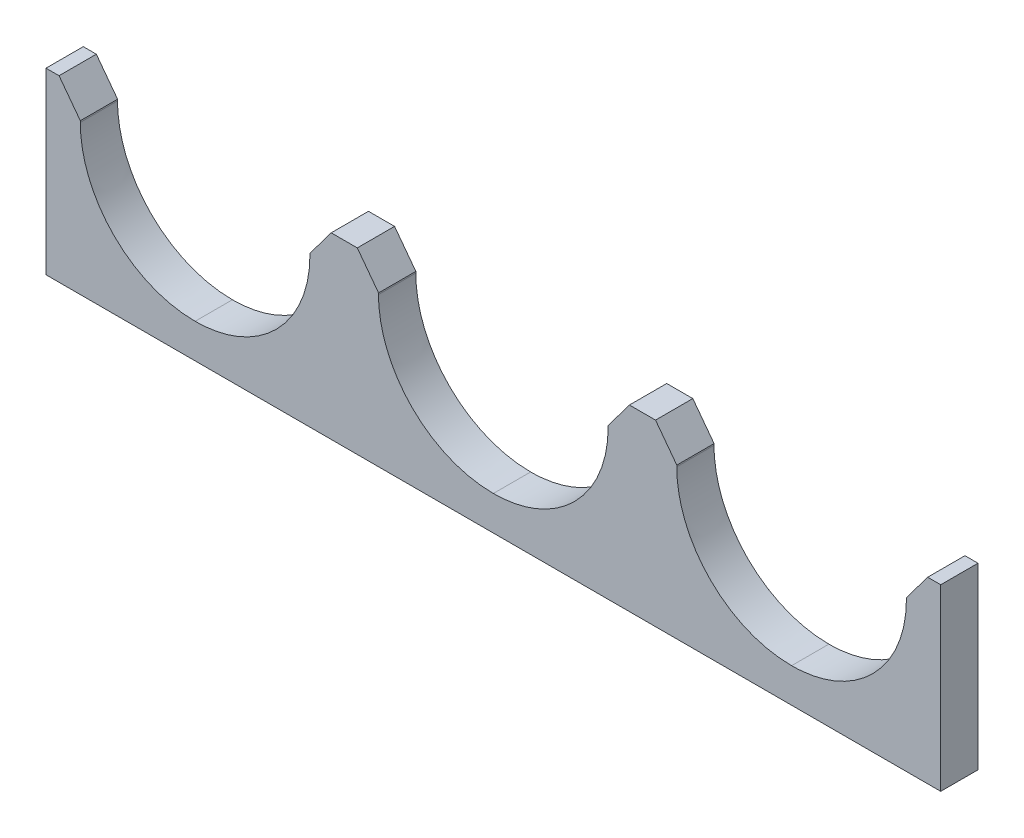
ISO-10303-21;
HEADER;
FILE_DESCRIPTION(('STEP AP214'),'2;1');
FILE_NAME('part.step','',(''),(''),'','','');
FILE_SCHEMA(('AUTOMOTIVE_DESIGN { 1 0 10303 214 1 1 1 1 }'));
ENDSEC;
DATA;
#1=APPLICATION_CONTEXT('core data for automotive mechanical design processes');
#2=APPLICATION_PROTOCOL_DEFINITION('international standard','automotive_design',2000,#1);
#3=PRODUCT_CONTEXT('',#1,'mechanical');
#4=PRODUCT('Part','Part','',(#3));
#5=PRODUCT_RELATED_PRODUCT_CATEGORY('part','',(#4));
#6=PRODUCT_DEFINITION_FORMATION('','',#4);
#7=PRODUCT_DEFINITION_CONTEXT('part definition',#1,'design');
#8=PRODUCT_DEFINITION('design','',#6,#7);
#9=PRODUCT_DEFINITION_SHAPE('','',#8);
#10=(LENGTH_UNIT() NAMED_UNIT(*) SI_UNIT(.MILLI.,.METRE.));
#11=(NAMED_UNIT(*) PLANE_ANGLE_UNIT() SI_UNIT($,.RADIAN.));
#12=(NAMED_UNIT(*) SI_UNIT($,.STERADIAN.) SOLID_ANGLE_UNIT());
#13=UNCERTAINTY_MEASURE_WITH_UNIT(LENGTH_MEASURE(1.E-05),#10,'distance_accuracy_value','');
#14=(GEOMETRIC_REPRESENTATION_CONTEXT(3) GLOBAL_UNCERTAINTY_ASSIGNED_CONTEXT((#13)) GLOBAL_UNIT_ASSIGNED_CONTEXT((#10,
#11,#12)) REPRESENTATION_CONTEXT('',''));
#15=CARTESIAN_POINT('',(0.,0.,0.));
#16=DIRECTION('',(0.,0.,1.));
#17=DIRECTION('',(1.,0.,0.));
#18=AXIS2_PLACEMENT_3D('',#15,#16,#17);
#19=CARTESIAN_POINT('',(322.974945746528,-237.241366314888,12.5));
#20=CARTESIAN_POINT('',(322.977012803819,-237.405180605253,12.5));
#21=CARTESIAN_POINT('',(322.981189982096,-237.568499663141,12.5));
#22=CARTESIAN_POINT('',(322.981189982096,-237.732809185982,12.5));
#23=B_SPLINE_CURVE_WITH_KNOTS('',3,(#19,#20,#21,#22),.UNSPECIFIED.,.F.,.F.,(4,4),(0.,1.),.UNSPECIFIED.);
#24=DIRECTION('',(0.,0.,-1.));
#25=VECTOR('',#24,1.);
#26=SURFACE_OF_LINEAR_EXTRUSION('',#23,#25);
#27=CARTESIAN_POINT('',(322.974945746528,-237.241366314888,0.));
#28=CARTESIAN_POINT('',(322.977012803819,-237.405180605253,0.));
#29=CARTESIAN_POINT('',(322.981189982096,-237.568499663141,0.));
#30=CARTESIAN_POINT('',(322.981189982096,-237.732809185982,0.));
#31=B_SPLINE_CURVE_WITH_KNOTS('',3,(#27,#28,#29,#30),.UNSPECIFIED.,.F.,.F.,(4,4),(0.,1.),.UNSPECIFIED.);
#32=CARTESIAN_POINT('',(322.974945746528,-237.241366314888,0.));
#33=VERTEX_POINT('',#32);
#34=CARTESIAN_POINT('',(322.981189982096,-237.732809185982,0.));
#35=VERTEX_POINT('',#34);
#36=EDGE_CURVE('E231',#33,#35,#31,.T.);
#37=ORIENTED_EDGE('',*,*,#36,.T.);
#38=DIRECTION('',(0.,0.,-1.));
#39=VECTOR('',#38,1.);
#40=CARTESIAN_POINT('',(322.981189982096,-237.732809185982,12.5));
#41=LINE('',#40,#39);
#42=CARTESIAN_POINT('',(322.981189982096,-237.732809185982,12.5));
#43=VERTEX_POINT('',#42);
#44=EDGE_CURVE('E11',#43,#35,#41,.T.);
#45=ORIENTED_EDGE('',*,*,#44,.F.);
#46=CARTESIAN_POINT('',(322.974945746528,-237.241366314888,12.5));
#47=VERTEX_POINT('',#46);
#48=EDGE_CURVE('E339',#47,#43,#23,.T.);
#49=ORIENTED_EDGE('',*,*,#48,.F.);
#50=DIRECTION('',(0.,0.,-1.));
#51=VECTOR('',#50,1.);
#52=CARTESIAN_POINT('',(322.974945746528,-237.241366314888,12.5));
#53=LINE('',#52,#51);
#54=EDGE_CURVE('E227',#47,#33,#53,.T.);
#55=ORIENTED_EDGE('',*,*,#54,.T.);
#56=EDGE_LOOP('',(#37,#45,#49,#55));
#57=FACE_BOUND('',#56,.T.);
#58=ADVANCED_FACE('F32',(#57),#26,.F.);
#59=CARTESIAN_POINT('',(322.981189982096,-237.732809185982,12.5));
#60=CARTESIAN_POINT('',(322.981189982096,-258.995766271485,12.5));
#61=CARTESIAN_POINT('',(305.744128417969,-276.232806303766,12.5));
#62=CARTESIAN_POINT('',(284.481171332465,-276.232806303766,12.5));
#63=B_SPLINE_CURVE_WITH_KNOTS('',3,(#59,#60,#61,#62),.UNSPECIFIED.,.F.,.F.,(4,4),(1.,2.),.UNSPECIFIED.);
#64=DIRECTION('',(0.,0.,-1.));
#65=VECTOR('',#64,1.);
#66=SURFACE_OF_LINEAR_EXTRUSION('',#63,#65);
#67=CARTESIAN_POINT('',(322.981189982096,-237.732809185982,0.));
#68=CARTESIAN_POINT('',(322.981189982096,-258.995766271485,0.));
#69=CARTESIAN_POINT('',(305.744128417969,-276.232806303766,0.));
#70=CARTESIAN_POINT('',(284.481171332465,-276.232806303766,0.));
#71=B_SPLINE_CURVE_WITH_KNOTS('',3,(#67,#68,#69,#70),.UNSPECIFIED.,.F.,.F.,(4,4),(1.,2.),.UNSPECIFIED.);
#72=CARTESIAN_POINT('',(284.481171332465,-276.232806303766,0.));
#73=VERTEX_POINT('',#72);
#74=EDGE_CURVE('E236',#35,#73,#71,.T.);
#75=ORIENTED_EDGE('',*,*,#74,.T.);
#76=DIRECTION('',(0.,0.,-1.));
#77=VECTOR('',#76,1.);
#78=CARTESIAN_POINT('',(284.481171332465,-276.232806303766,12.5));
#79=LINE('',#78,#77);
#80=CARTESIAN_POINT('',(284.481171332465,-276.232806303766,12.5));
#81=VERTEX_POINT('',#80);
#82=EDGE_CURVE('E41',#81,#73,#79,.T.);
#83=ORIENTED_EDGE('',*,*,#82,.F.);
#84=EDGE_CURVE('E143',#43,#81,#63,.T.);
#85=ORIENTED_EDGE('',*,*,#84,.F.);
#86=ORIENTED_EDGE('',*,*,#44,.T.);
#87=EDGE_LOOP('',(#75,#83,#85,#86));
#88=FACE_BOUND('',#87,.T.);
#89=ADVANCED_FACE('F468',(#88),#66,.F.);
#90=CARTESIAN_POINT('',(284.481171332465,-276.232806303766,12.5));
#91=CARTESIAN_POINT('',(263.218214246962,-276.232806303766,12.5));
#92=CARTESIAN_POINT('',(245.981174214681,-258.995766271485,12.5));
#93=CARTESIAN_POINT('',(245.981174214681,-237.732809185982,12.5));
#94=B_SPLINE_CURVE_WITH_KNOTS('',3,(#90,#91,#92,#93),.UNSPECIFIED.,.F.,.F.,(4,4),(2.,3.),.UNSPECIFIED.);
#95=DIRECTION('',(0.,0.,-1.));
#96=VECTOR('',#95,1.);
#97=SURFACE_OF_LINEAR_EXTRUSION('',#94,#96);
#98=CARTESIAN_POINT('',(284.481171332465,-276.232806303766,0.));
#99=CARTESIAN_POINT('',(263.218214246962,-276.232806303766,0.));
#100=CARTESIAN_POINT('',(245.981174214681,-258.995766271485,0.));
#101=CARTESIAN_POINT('',(245.981174214681,-237.732809185982,0.));
#102=B_SPLINE_CURVE_WITH_KNOTS('',3,(#98,#99,#100,#101),.UNSPECIFIED.,.F.,.F.,(4,4),(2.,3.),.UNSPECIFIED.);
#103=CARTESIAN_POINT('',(245.981174214681,-237.732809185982,0.));
#104=VERTEX_POINT('',#103);
#105=EDGE_CURVE('E243',#73,#104,#102,.T.);
#106=ORIENTED_EDGE('',*,*,#105,.T.);
#107=DIRECTION('',(0.,0.,-1.));
#108=VECTOR('',#107,1.);
#109=CARTESIAN_POINT('',(245.981174214681,-237.732809185982,12.5));
#110=LINE('',#109,#108);
#111=CARTESIAN_POINT('',(245.981174214681,-237.732809185982,12.5));
#112=VERTEX_POINT('',#111);
#113=EDGE_CURVE('E397',#112,#104,#110,.T.);
#114=ORIENTED_EDGE('',*,*,#113,.F.);
#115=EDGE_CURVE('E405',#81,#112,#94,.T.);
#116=ORIENTED_EDGE('',*,*,#115,.F.);
#117=ORIENTED_EDGE('',*,*,#82,.T.);
#118=EDGE_LOOP('',(#106,#114,#116,#117));
#119=FACE_BOUND('',#118,.T.);
#120=ADVANCED_FACE('F403',(#119),#97,.F.);
#121=CARTESIAN_POINT('',(245.981174214681,-237.732809185982,12.5));
#122=CARTESIAN_POINT('',(245.981174214681,-237.568478131294,12.5));
#123=CARTESIAN_POINT('',(245.985351392958,-237.405180605253,12.5));
#124=CARTESIAN_POINT('',(245.987396918403,-237.241344783041,12.5));
#125=B_SPLINE_CURVE_WITH_KNOTS('',3,(#121,#122,#123,#124),.UNSPECIFIED.,.F.,.F.,(4,4),(3.,4.),.UNSPECIFIED.);
#126=DIRECTION('',(0.,0.,-1.));
#127=VECTOR('',#126,1.);
#128=SURFACE_OF_LINEAR_EXTRUSION('',#125,#127);
#129=CARTESIAN_POINT('',(245.981174214681,-237.732809185982,0.));
#130=CARTESIAN_POINT('',(245.981174214681,-237.568478131294,0.));
#131=CARTESIAN_POINT('',(245.985351392958,-237.405180605253,0.));
#132=CARTESIAN_POINT('',(245.987396918403,-237.241344783041,0.));
#133=B_SPLINE_CURVE_WITH_KNOTS('',3,(#129,#130,#131,#132),.UNSPECIFIED.,.F.,.F.,(4,4),(3.,4.),.UNSPECIFIED.);
#134=CARTESIAN_POINT('',(245.987396918403,-237.241344783041,0.));
#135=VERTEX_POINT('',#134);
#136=EDGE_CURVE('E250',#104,#135,#133,.T.);
#137=ORIENTED_EDGE('',*,*,#136,.T.);
#138=DIRECTION('',(0.,0.,-1.));
#139=VECTOR('',#138,1.);
#140=CARTESIAN_POINT('',(245.987396918403,-237.241344783041,12.5));
#141=LINE('',#140,#139);
#142=CARTESIAN_POINT('',(245.987396918403,-237.241344783041,12.5));
#143=VERTEX_POINT('',#142);
#144=EDGE_CURVE('E394',#143,#135,#141,.T.);
#145=ORIENTED_EDGE('',*,*,#144,.F.);
#146=EDGE_CURVE('E423',#112,#143,#125,.T.);
#147=ORIENTED_EDGE('',*,*,#146,.F.);
#148=ORIENTED_EDGE('',*,*,#113,.T.);
#149=EDGE_LOOP('',(#137,#145,#147,#148));
#150=FACE_BOUND('',#149,.T.);
#151=ADVANCED_FACE('F414',(#150),#128,.F.);
#152=CARTESIAN_POINT('',(245.987396918403,-237.241344783041,12.5));
#153=DIRECTION('',(-0.800074782706946,-0.599900276776427,0.));
#154=DIRECTION('',(0.599900276776427,-0.800074782706946,0.));
#155=AXIS2_PLACEMENT_3D('',#152,#153,#154);
#156=PLANE('',#155);
#157=DIRECTION('',(-0.599900276776427,0.800074782706946,0.));
#158=VECTOR('',#157,1.);
#159=CARTESIAN_POINT('',(245.987396918403,-237.241344783041,0.));
#160=LINE('',#159,#158);
#161=CARTESIAN_POINT('',(238.857836405436,-227.732795113987,0.));
#162=VERTEX_POINT('',#161);
#163=EDGE_CURVE('E257',#135,#162,#160,.T.);
#164=ORIENTED_EDGE('',*,*,#163,.T.);
#165=DIRECTION('',(0.,0.,-1.));
#166=VECTOR('',#165,1.);
#167=CARTESIAN_POINT('',(238.857836405436,-227.732795113987,12.5));
#168=LINE('',#167,#166);
#169=CARTESIAN_POINT('',(238.857836405436,-227.732795113987,12.5));
#170=VERTEX_POINT('',#169);
#171=EDGE_CURVE('E391',#170,#162,#168,.T.);
#172=ORIENTED_EDGE('',*,*,#171,.F.);
#173=DIRECTION('',(-0.599900276776427,0.800074782706946,0.));
#174=VECTOR('',#173,1.);
#175=CARTESIAN_POINT('',(245.987396918403,-237.241344783041,12.5));
#176=LINE('',#175,#174);
#177=EDGE_CURVE('E420',#143,#170,#176,.T.);
#178=ORIENTED_EDGE('',*,*,#177,.F.);
#179=ORIENTED_EDGE('',*,*,#144,.T.);
#180=EDGE_LOOP('',(#164,#172,#178,#179));
#181=FACE_BOUND('',#180,.T.);
#182=ADVANCED_FACE('F418',(#181),#156,.F.);
#183=CARTESIAN_POINT('',(238.857836405436,-227.732795113987,12.5));
#184=DIRECTION('',(0.,-1.,0.));
#185=DIRECTION('',(0.,0.,-1.));
#186=AXIS2_PLACEMENT_3D('',#183,#184,#185);
#187=PLANE('',#186);
#188=DIRECTION('',(-1.,0.,0.));
#189=VECTOR('',#188,1.);
#190=CARTESIAN_POINT('',(238.857836405436,-227.732795113987,0.));
#191=LINE('',#190,#189);
#192=CARTESIAN_POINT('',(230.104537794325,-227.732795113987,0.));
#193=VERTEX_POINT('',#192);
#194=EDGE_CURVE('E262',#162,#193,#191,.T.);
#195=ORIENTED_EDGE('',*,*,#194,.T.);
#196=DIRECTION('',(0.,0.,-1.));
#197=VECTOR('',#196,1.);
#198=CARTESIAN_POINT('',(230.104537794325,-227.732795113987,12.5));
#199=LINE('',#198,#197);
#200=CARTESIAN_POINT('',(230.104537794325,-227.732795113987,12.5));
#201=VERTEX_POINT('',#200);
#202=EDGE_CURVE('E388',#201,#193,#199,.T.);
#203=ORIENTED_EDGE('',*,*,#202,.F.);
#204=DIRECTION('',(-1.,0.,0.));
#205=VECTOR('',#204,1.);
#206=CARTESIAN_POINT('',(238.857836405436,-227.732795113987,12.5));
#207=LINE('',#206,#205);
#208=EDGE_CURVE('E422',#170,#201,#207,.T.);
#209=ORIENTED_EDGE('',*,*,#208,.F.);
#210=ORIENTED_EDGE('',*,*,#171,.T.);
#211=EDGE_LOOP('',(#195,#203,#209,#210));
#212=FACE_BOUND('',#211,.T.);
#213=ADVANCED_FACE('F458',(#212),#187,.F.);
#214=CARTESIAN_POINT('',(230.104537794325,-227.732795113987,12.5));
#215=DIRECTION('',(0.80007456514426,-0.59990056693524,0.));
#216=DIRECTION('',(0.59990056693524,0.800074565144261,0.));
#217=AXIS2_PLACEMENT_3D('',#214,#215,#216);
#218=PLANE('',#217);
#219=DIRECTION('',(-0.59990056693524,-0.80007456514426,0.));
#220=VECTOR('',#219,1.);
#221=CARTESIAN_POINT('',(230.104537794325,-227.732795113987,0.));
#222=LINE('',#221,#220);
#223=CARTESIAN_POINT('',(222.974955749512,-237.241366314888,0.));
#224=VERTEX_POINT('',#223);
#225=EDGE_CURVE('E264',#193,#224,#222,.T.);
#226=ORIENTED_EDGE('',*,*,#225,.T.);
#227=DIRECTION('',(0.,0.,-1.));
#228=VECTOR('',#227,1.);
#229=CARTESIAN_POINT('',(222.974955749512,-237.241366314888,12.5));
#230=LINE('',#229,#228);
#231=CARTESIAN_POINT('',(222.974955749512,-237.241366314888,12.5));
#232=VERTEX_POINT('',#231);
#233=EDGE_CURVE('E385',#232,#224,#230,.T.);
#234=ORIENTED_EDGE('',*,*,#233,.F.);
#235=DIRECTION('',(-0.59990056693524,-0.80007456514426,0.));
#236=VECTOR('',#235,1.);
#237=CARTESIAN_POINT('',(230.104537794325,-227.732795113987,12.5));
#238=LINE('',#237,#236);
#239=EDGE_CURVE('E425',#201,#232,#238,.T.);
#240=ORIENTED_EDGE('',*,*,#239,.F.);
#241=ORIENTED_EDGE('',*,*,#202,.T.);
#242=EDGE_LOOP('',(#226,#234,#240,#241));
#243=FACE_BOUND('',#242,.T.);
#244=ADVANCED_FACE('F453',(#243),#218,.F.);
#245=CARTESIAN_POINT('',(222.974955749512,-237.241366314888,12.5));
#246=CARTESIAN_POINT('',(222.977001274957,-237.405180605253,12.5));
#247=CARTESIAN_POINT('',(222.981178453233,-237.568499663141,12.5));
#248=CARTESIAN_POINT('',(222.981178453233,-237.732809185982,12.5));
#249=B_SPLINE_CURVE_WITH_KNOTS('',3,(#245,#246,#247,#248),.UNSPECIFIED.,.F.,.F.,(4,4),(7.,8.),.UNSPECIFIED.);
#250=DIRECTION('',(0.,0.,-1.));
#251=VECTOR('',#250,1.);
#252=SURFACE_OF_LINEAR_EXTRUSION('',#249,#251);
#253=CARTESIAN_POINT('',(222.974955749512,-237.241366314888,0.));
#254=CARTESIAN_POINT('',(222.977001274957,-237.405180605253,0.));
#255=CARTESIAN_POINT('',(222.981178453233,-237.568499663141,0.));
#256=CARTESIAN_POINT('',(222.981178453233,-237.732809185982,0.));
#257=B_SPLINE_CURVE_WITH_KNOTS('',3,(#253,#254,#255,#256),.UNSPECIFIED.,.F.,.F.,(4,4),(7.,8.),.UNSPECIFIED.);
#258=CARTESIAN_POINT('',(222.981178453233,-237.732809185982,0.));
#259=VERTEX_POINT('',#258);
#260=EDGE_CURVE('E266',#224,#259,#257,.T.);
#261=ORIENTED_EDGE('',*,*,#260,.T.);
#262=DIRECTION('',(0.,0.,-1.));
#263=VECTOR('',#262,1.);
#264=CARTESIAN_POINT('',(222.981178453233,-237.732809185982,12.5));
#265=LINE('',#264,#263);
#266=CARTESIAN_POINT('',(222.981178453233,-237.732809185982,12.5));
#267=VERTEX_POINT('',#266);
#268=EDGE_CURVE('E382',#267,#259,#265,.T.);
#269=ORIENTED_EDGE('',*,*,#268,.F.);
#270=EDGE_CURVE('E434',#232,#267,#249,.T.);
#271=ORIENTED_EDGE('',*,*,#270,.F.);
#272=ORIENTED_EDGE('',*,*,#233,.T.);
#273=EDGE_LOOP('',(#261,#269,#271,#272));
#274=FACE_BOUND('',#273,.T.);
#275=ADVANCED_FACE('F448',(#274),#252,.F.);
#276=CARTESIAN_POINT('',(222.981178453233,-237.732809185982,12.5));
#277=CARTESIAN_POINT('',(222.981178453233,-258.995766271485,12.5));
#278=CARTESIAN_POINT('',(205.744138420953,-276.232806303766,12.5));
#279=CARTESIAN_POINT('',(184.481181335449,-276.232806303766,12.5));
#280=B_SPLINE_CURVE_WITH_KNOTS('',3,(#276,#277,#278,#279),.UNSPECIFIED.,.F.,.F.,(4,4),(8.,9.),.UNSPECIFIED.);
#281=DIRECTION('',(0.,0.,-1.));
#282=VECTOR('',#281,1.);
#283=SURFACE_OF_LINEAR_EXTRUSION('',#280,#282);
#284=CARTESIAN_POINT('',(222.981178453233,-237.732809185982,0.));
#285=CARTESIAN_POINT('',(222.981178453233,-258.995766271485,0.));
#286=CARTESIAN_POINT('',(205.744138420953,-276.232806303766,0.));
#287=CARTESIAN_POINT('',(184.481181335449,-276.232806303766,0.));
#288=B_SPLINE_CURVE_WITH_KNOTS('',3,(#284,#285,#286,#287),.UNSPECIFIED.,.F.,.F.,(4,4),(8.,9.),.UNSPECIFIED.);
#289=CARTESIAN_POINT('',(184.481181335449,-276.232806303766,0.));
#290=VERTEX_POINT('',#289);
#291=EDGE_CURVE('E270',#259,#290,#288,.T.);
#292=ORIENTED_EDGE('',*,*,#291,.T.);
#293=DIRECTION('',(0.,0.,-1.));
#294=VECTOR('',#293,1.);
#295=CARTESIAN_POINT('',(184.481181335449,-276.232806303766,12.5));
#296=LINE('',#295,#294);
#297=CARTESIAN_POINT('',(184.481181335449,-276.232806303766,12.5));
#298=VERTEX_POINT('',#297);
#299=EDGE_CURVE('E379',#298,#290,#296,.T.);
#300=ORIENTED_EDGE('',*,*,#299,.F.);
#301=EDGE_CURVE('E439',#267,#298,#280,.T.);
#302=ORIENTED_EDGE('',*,*,#301,.F.);
#303=ORIENTED_EDGE('',*,*,#268,.T.);
#304=EDGE_LOOP('',(#292,#300,#302,#303));
#305=FACE_BOUND('',#304,.T.);
#306=ADVANCED_FACE('F452',(#305),#283,.F.);
#307=CARTESIAN_POINT('',(184.481181335449,-276.232806303766,12.5));
#308=CARTESIAN_POINT('',(163.218224249946,-276.232806303766,12.5));
#309=CARTESIAN_POINT('',(145.981184217665,-258.995766271485,12.5));
#310=CARTESIAN_POINT('',(145.981184217665,-237.732809185982,12.5));
#311=B_SPLINE_CURVE_WITH_KNOTS('',3,(#307,#308,#309,#310),.UNSPECIFIED.,.F.,.F.,(4,4),(9.,10.),.UNSPECIFIED.);
#312=DIRECTION('',(0.,0.,-1.));
#313=VECTOR('',#312,1.);
#314=SURFACE_OF_LINEAR_EXTRUSION('',#311,#313);
#315=CARTESIAN_POINT('',(184.481181335449,-276.232806303766,0.));
#316=CARTESIAN_POINT('',(163.218224249946,-276.232806303766,0.));
#317=CARTESIAN_POINT('',(145.981184217665,-258.995766271485,0.));
#318=CARTESIAN_POINT('',(145.981184217665,-237.732809185982,0.));
#319=B_SPLINE_CURVE_WITH_KNOTS('',3,(#315,#316,#317,#318),.UNSPECIFIED.,.F.,.F.,(4,4),(9.,10.),.UNSPECIFIED.);
#320=CARTESIAN_POINT('',(145.981184217665,-237.732809185982,0.));
#321=VERTEX_POINT('',#320);
#322=EDGE_CURVE('E277',#290,#321,#319,.T.);
#323=ORIENTED_EDGE('',*,*,#322,.T.);
#324=DIRECTION('',(0.,0.,-1.));
#325=VECTOR('',#324,1.);
#326=CARTESIAN_POINT('',(145.981184217665,-237.732809185982,12.5));
#327=LINE('',#326,#325);
#328=CARTESIAN_POINT('',(145.981184217665,-237.732809185982,12.5));
#329=VERTEX_POINT('',#328);
#330=EDGE_CURVE('E376',#329,#321,#327,.T.);
#331=ORIENTED_EDGE('',*,*,#330,.F.);
#332=EDGE_CURVE('E783',#298,#329,#311,.T.);
#333=ORIENTED_EDGE('',*,*,#332,.F.);
#334=ORIENTED_EDGE('',*,*,#299,.T.);
#335=EDGE_LOOP('',(#323,#331,#333,#334));
#336=FACE_BOUND('',#335,.T.);
#337=ADVANCED_FACE('F546',(#336),#314,.F.);
#338=CARTESIAN_POINT('',(145.981184217665,-237.732809185982,12.5));
#339=CARTESIAN_POINT('',(145.981184217665,-237.568499663141,12.5));
#340=CARTESIAN_POINT('',(145.985361395942,-237.405180605253,12.5));
#341=CARTESIAN_POINT('',(145.987406921387,-237.241344783041,12.5));
#342=B_SPLINE_CURVE_WITH_KNOTS('',3,(#338,#339,#340,#341),.UNSPECIFIED.,.F.,.F.,(4,4),(10.,11.),.UNSPECIFIED.);
#343=DIRECTION('',(0.,0.,-1.));
#344=VECTOR('',#343,1.);
#345=SURFACE_OF_LINEAR_EXTRUSION('',#342,#344);
#346=CARTESIAN_POINT('',(145.981184217665,-237.732809185982,0.));
#347=CARTESIAN_POINT('',(145.981184217665,-237.568499663141,0.));
#348=CARTESIAN_POINT('',(145.985361395942,-237.405180605253,0.));
#349=CARTESIAN_POINT('',(145.987406921387,-237.241344783041,0.));
#350=B_SPLINE_CURVE_WITH_KNOTS('',3,(#346,#347,#348,#349),.UNSPECIFIED.,.F.,.F.,(4,4),(10.,11.),.UNSPECIFIED.);
#351=CARTESIAN_POINT('',(145.987406921387,-237.241344783041,0.));
#352=VERTEX_POINT('',#351);
#353=EDGE_CURVE('E284',#321,#352,#350,.T.);
#354=ORIENTED_EDGE('',*,*,#353,.T.);
#355=DIRECTION('',(0.,0.,-1.));
#356=VECTOR('',#355,1.);
#357=CARTESIAN_POINT('',(145.987406921387,-237.241344783041,12.5));
#358=LINE('',#357,#356);
#359=CARTESIAN_POINT('',(145.987406921387,-237.241344783041,12.5));
#360=VERTEX_POINT('',#359);
#361=EDGE_CURVE('E373',#360,#352,#358,.T.);
#362=ORIENTED_EDGE('',*,*,#361,.F.);
#363=EDGE_CURVE('E781',#329,#360,#342,.T.);
#364=ORIENTED_EDGE('',*,*,#363,.F.);
#365=ORIENTED_EDGE('',*,*,#330,.T.);
#366=EDGE_LOOP('',(#354,#362,#364,#365));
#367=FACE_BOUND('',#366,.T.);
#368=ADVANCED_FACE('F555',(#367),#345,.F.);
#369=CARTESIAN_POINT('',(145.987406921387,-237.241344783041,12.5));
#370=DIRECTION('',(-0.800074782706946,-0.599900276776427,0.));
#371=DIRECTION('',(0.599900276776427,-0.800074782706946,0.));
#372=AXIS2_PLACEMENT_3D('',#369,#370,#371);
#373=PLANE('',#372);
#374=DIRECTION('',(-0.599900276776427,0.800074782706946,0.));
#375=VECTOR('',#374,1.);
#376=CARTESIAN_POINT('',(145.987406921387,-237.241344783041,0.));
#377=LINE('',#376,#375);
#378=CARTESIAN_POINT('',(138.85784640842,-227.732795113987,0.));
#379=VERTEX_POINT('',#378);
#380=EDGE_CURVE('E291',#352,#379,#377,.T.);
#381=ORIENTED_EDGE('',*,*,#380,.T.);
#382=DIRECTION('',(0.,0.,-1.));
#383=VECTOR('',#382,1.);
#384=CARTESIAN_POINT('',(138.85784640842,-227.732795113987,12.5));
#385=LINE('',#384,#383);
#386=CARTESIAN_POINT('',(138.85784640842,-227.732795113987,12.5));
#387=VERTEX_POINT('',#386);
#388=EDGE_CURVE('E370',#387,#379,#385,.T.);
#389=ORIENTED_EDGE('',*,*,#388,.F.);
#390=DIRECTION('',(-0.599900276776427,0.800074782706946,0.));
#391=VECTOR('',#390,1.);
#392=CARTESIAN_POINT('',(145.987406921387,-237.241344783041,12.5));
#393=LINE('',#392,#391);
#394=EDGE_CURVE('E774',#360,#387,#393,.T.);
#395=ORIENTED_EDGE('',*,*,#394,.F.);
#396=ORIENTED_EDGE('',*,*,#361,.T.);
#397=EDGE_LOOP('',(#381,#389,#395,#396));
#398=FACE_BOUND('',#397,.T.);
#399=ADVANCED_FACE('F564',(#398),#373,.F.);
#400=CARTESIAN_POINT('',(138.85784640842,-227.732795113987,12.5));
#401=DIRECTION('',(0.,-1.,0.));
#402=DIRECTION('',(0.,0.,-1.));
#403=AXIS2_PLACEMENT_3D('',#400,#401,#402);
#404=PLANE('',#403);
#405=DIRECTION('',(-1.,0.,0.));
#406=VECTOR('',#405,1.);
#407=CARTESIAN_POINT('',(138.85784640842,-227.732795113987,0.));
#408=LINE('',#407,#406);
#409=CARTESIAN_POINT('',(130.104547797309,-227.732795113987,0.));
#410=VERTEX_POINT('',#409);
#411=EDGE_CURVE('E296',#379,#410,#408,.T.);
#412=ORIENTED_EDGE('',*,*,#411,.T.);
#413=DIRECTION('',(0.,0.,-1.));
#414=VECTOR('',#413,1.);
#415=CARTESIAN_POINT('',(130.104547797309,-227.732795113987,12.5));
#416=LINE('',#415,#414);
#417=CARTESIAN_POINT('',(130.104547797309,-227.732795113987,12.5));
#418=VERTEX_POINT('',#417);
#419=EDGE_CURVE('E367',#418,#410,#416,.T.);
#420=ORIENTED_EDGE('',*,*,#419,.F.);
#421=DIRECTION('',(-1.,0.,0.));
#422=VECTOR('',#421,1.);
#423=CARTESIAN_POINT('',(138.85784640842,-227.732795113987,12.5));
#424=LINE('',#423,#422);
#425=EDGE_CURVE('E771',#387,#418,#424,.T.);
#426=ORIENTED_EDGE('',*,*,#425,.F.);
#427=ORIENTED_EDGE('',*,*,#388,.T.);
#428=EDGE_LOOP('',(#412,#420,#426,#427));
#429=FACE_BOUND('',#428,.T.);
#430=ADVANCED_FACE('F574',(#429),#404,.F.);
#431=CARTESIAN_POINT('',(130.104547797309,-227.732795113987,12.5));
#432=DIRECTION('',(0.800074565144272,-0.599900566935224,0.));
#433=DIRECTION('',(0.599900566935224,0.800074565144272,0.));
#434=AXIS2_PLACEMENT_3D('',#431,#432,#433);
#435=PLANE('',#434);
#436=DIRECTION('',(-0.599900566935224,-0.800074565144272,0.));
#437=VECTOR('',#436,1.);
#438=CARTESIAN_POINT('',(130.104547797309,-227.732795113987,0.));
#439=LINE('',#438,#437);
#440=CARTESIAN_POINT('',(122.974965752496,-237.241366314888,0.));
#441=VERTEX_POINT('',#440);
#442=EDGE_CURVE('E298',#410,#441,#439,.T.);
#443=ORIENTED_EDGE('',*,*,#442,.T.);
#444=DIRECTION('',(0.,0.,-1.));
#445=VECTOR('',#444,1.);
#446=CARTESIAN_POINT('',(122.974965752496,-237.241366314888,12.5));
#447=LINE('',#446,#445);
#448=CARTESIAN_POINT('',(122.974965752496,-237.241366314888,12.5));
#449=VERTEX_POINT('',#448);
#450=EDGE_CURVE('E364',#449,#441,#447,.T.);
#451=ORIENTED_EDGE('',*,*,#450,.F.);
#452=DIRECTION('',(-0.599900566935224,-0.800074565144272,0.));
#453=VECTOR('',#452,1.);
#454=CARTESIAN_POINT('',(130.104547797309,-227.732795113987,12.5));
#455=LINE('',#454,#453);
#456=EDGE_CURVE('E769',#418,#449,#455,.T.);
#457=ORIENTED_EDGE('',*,*,#456,.F.);
#458=ORIENTED_EDGE('',*,*,#419,.T.);
#459=EDGE_LOOP('',(#443,#451,#457,#458));
#460=FACE_BOUND('',#459,.T.);
#461=ADVANCED_FACE('F584',(#460),#435,.F.);
#462=CARTESIAN_POINT('',(122.974965752496,-237.241366314888,12.5));
#463=CARTESIAN_POINT('',(122.977011277941,-237.405180605253,12.5));
#464=CARTESIAN_POINT('',(122.981188456217,-237.568499663141,12.5));
#465=CARTESIAN_POINT('',(122.981188456217,-237.732809185982,12.5));
#466=B_SPLINE_CURVE_WITH_KNOTS('',3,(#462,#463,#464,#465),.UNSPECIFIED.,.F.,.F.,(4,4),(14.,15.),.UNSPECIFIED.);
#467=DIRECTION('',(0.,0.,-1.));
#468=VECTOR('',#467,1.);
#469=SURFACE_OF_LINEAR_EXTRUSION('',#466,#468);
#470=CARTESIAN_POINT('',(122.974965752496,-237.241366314888,0.));
#471=CARTESIAN_POINT('',(122.977011277941,-237.405180605253,0.));
#472=CARTESIAN_POINT('',(122.981188456217,-237.568499663141,0.));
#473=CARTESIAN_POINT('',(122.981188456217,-237.732809185982,0.));
#474=B_SPLINE_CURVE_WITH_KNOTS('',3,(#470,#471,#472,#473),.UNSPECIFIED.,.F.,.F.,(4,4),(14.,15.),.UNSPECIFIED.);
#475=CARTESIAN_POINT('',(122.981188456217,-237.732809185982,0.));
#476=VERTEX_POINT('',#475);
#477=EDGE_CURVE('E300',#441,#476,#474,.T.);
#478=ORIENTED_EDGE('',*,*,#477,.T.);
#479=DIRECTION('',(0.,0.,-1.));
#480=VECTOR('',#479,1.);
#481=CARTESIAN_POINT('',(122.981188456217,-237.732809185982,12.5));
#482=LINE('',#481,#480);
#483=CARTESIAN_POINT('',(122.981188456217,-237.732809185982,12.5));
#484=VERTEX_POINT('',#483);
#485=EDGE_CURVE('E361',#484,#476,#482,.T.);
#486=ORIENTED_EDGE('',*,*,#485,.F.);
#487=EDGE_CURVE('E762',#449,#484,#466,.T.);
#488=ORIENTED_EDGE('',*,*,#487,.F.);
#489=ORIENTED_EDGE('',*,*,#450,.T.);
#490=EDGE_LOOP('',(#478,#486,#488,#489));
#491=FACE_BOUND('',#490,.T.);
#492=ADVANCED_FACE('F594',(#491),#469,.F.);
#493=CARTESIAN_POINT('',(122.981188456217,-237.732809185982,12.5));
#494=CARTESIAN_POINT('',(122.981188456217,-258.995766271485,12.5));
#495=CARTESIAN_POINT('',(105.744148423937,-276.232806303766,12.5));
#496=CARTESIAN_POINT('',(84.4811913384335,-276.232806303766,12.5));
#497=B_SPLINE_CURVE_WITH_KNOTS('',3,(#493,#494,#495,#496),.UNSPECIFIED.,.F.,.F.,(4,4),(15.,16.),.UNSPECIFIED.);
#498=DIRECTION('',(0.,0.,-1.));
#499=VECTOR('',#498,1.);
#500=SURFACE_OF_LINEAR_EXTRUSION('',#497,#499);
#501=CARTESIAN_POINT('',(122.981188456217,-237.732809185982,0.));
#502=CARTESIAN_POINT('',(122.981188456217,-258.995766271485,0.));
#503=CARTESIAN_POINT('',(105.744148423937,-276.232806303766,0.));
#504=CARTESIAN_POINT('',(84.4811913384335,-276.232806303766,0.));
#505=B_SPLINE_CURVE_WITH_KNOTS('',3,(#501,#502,#503,#504),.UNSPECIFIED.,.F.,.F.,(4,4),(15.,16.),.UNSPECIFIED.);
#506=CARTESIAN_POINT('',(84.4811913384335,-276.232806303766,0.));
#507=VERTEX_POINT('',#506);
#508=EDGE_CURVE('E304',#476,#507,#505,.T.);
#509=ORIENTED_EDGE('',*,*,#508,.T.);
#510=DIRECTION('',(0.,0.,-1.));
#511=VECTOR('',#510,1.);
#512=CARTESIAN_POINT('',(84.4811913384335,-276.232806303766,12.5));
#513=LINE('',#512,#511);
#514=CARTESIAN_POINT('',(84.4811913384335,-276.232806303766,12.5));
#515=VERTEX_POINT('',#514);
#516=EDGE_CURVE('E358',#515,#507,#513,.T.);
#517=ORIENTED_EDGE('',*,*,#516,.F.);
#518=EDGE_CURVE('E759',#484,#515,#497,.T.);
#519=ORIENTED_EDGE('',*,*,#518,.F.);
#520=ORIENTED_EDGE('',*,*,#485,.T.);
#521=EDGE_LOOP('',(#509,#517,#519,#520));
#522=FACE_BOUND('',#521,.T.);
#523=ADVANCED_FACE('F604',(#522),#500,.F.);
#524=CARTESIAN_POINT('',(84.4811913384335,-276.232806303766,12.5));
#525=CARTESIAN_POINT('',(63.2182127210829,-276.232806303766,12.5));
#526=CARTESIAN_POINT('',(45.9811726888021,-258.995766271485,12.5));
#527=CARTESIAN_POINT('',(45.9811726888021,-237.732809185982,12.5));
#528=B_SPLINE_CURVE_WITH_KNOTS('',3,(#524,#525,#526,#527),.UNSPECIFIED.,.F.,.F.,(4,4),(16.,17.),.UNSPECIFIED.);
#529=DIRECTION('',(0.,0.,-1.));
#530=VECTOR('',#529,1.);
#531=SURFACE_OF_LINEAR_EXTRUSION('',#528,#530);
#532=CARTESIAN_POINT('',(84.4811913384335,-276.232806303766,0.));
#533=CARTESIAN_POINT('',(63.2182127210829,-276.232806303766,0.));
#534=CARTESIAN_POINT('',(45.9811726888021,-258.995766271485,0.));
#535=CARTESIAN_POINT('',(45.9811726888021,-237.732809185982,0.));
#536=B_SPLINE_CURVE_WITH_KNOTS('',3,(#532,#533,#534,#535),.UNSPECIFIED.,.F.,.F.,(4,4),(16.,17.),.UNSPECIFIED.);
#537=CARTESIAN_POINT('',(45.9811726888021,-237.732809185982,0.));
#538=VERTEX_POINT('',#537);
#539=EDGE_CURVE('E311',#507,#538,#536,.T.);
#540=ORIENTED_EDGE('',*,*,#539,.T.);
#541=DIRECTION('',(0.,0.,-1.));
#542=VECTOR('',#541,1.);
#543=CARTESIAN_POINT('',(45.9811726888021,-237.732809185982,12.5));
#544=LINE('',#543,#542);
#545=CARTESIAN_POINT('',(45.9811726888021,-237.732809185982,12.5));
#546=VERTEX_POINT('',#545);
#547=EDGE_CURVE('E355',#546,#538,#544,.T.);
#548=ORIENTED_EDGE('',*,*,#547,.F.);
#549=EDGE_CURVE('E727',#515,#546,#528,.T.);
#550=ORIENTED_EDGE('',*,*,#549,.F.);
#551=ORIENTED_EDGE('',*,*,#516,.T.);
#552=EDGE_LOOP('',(#540,#548,#550,#551));
#553=FACE_BOUND('',#552,.T.);
#554=ADVANCED_FACE('F614',(#553),#531,.F.);
#555=CARTESIAN_POINT('',(45.9811726888021,-237.732809185982,12.5));
#556=CARTESIAN_POINT('',(45.9811726888021,-237.568478131294,12.5));
#557=CARTESIAN_POINT('',(45.9853498670793,-237.405180605253,12.5));
#558=CARTESIAN_POINT('',(45.9873953925239,-237.241344783041,12.5));
#559=B_SPLINE_CURVE_WITH_KNOTS('',3,(#555,#556,#557,#558),.UNSPECIFIED.,.F.,.F.,(4,4),(17.,18.),.UNSPECIFIED.);
#560=DIRECTION('',(0.,0.,-1.));
#561=VECTOR('',#560,1.);
#562=SURFACE_OF_LINEAR_EXTRUSION('',#559,#561);
#563=CARTESIAN_POINT('',(45.9811726888021,-237.732809185982,0.));
#564=CARTESIAN_POINT('',(45.9811726888021,-237.568478131294,0.));
#565=CARTESIAN_POINT('',(45.9853498670793,-237.405180605253,0.));
#566=CARTESIAN_POINT('',(45.9873953925239,-237.241344783041,0.));
#567=B_SPLINE_CURVE_WITH_KNOTS('',3,(#563,#564,#565,#566),.UNSPECIFIED.,.F.,.F.,(4,4),(17.,18.),.UNSPECIFIED.);
#568=CARTESIAN_POINT('',(45.9873953925239,-237.241344783041,0.));
#569=VERTEX_POINT('',#568);
#570=EDGE_CURVE('E318',#538,#569,#567,.T.);
#571=ORIENTED_EDGE('',*,*,#570,.T.);
#572=DIRECTION('',(0.,0.,-1.));
#573=VECTOR('',#572,1.);
#574=CARTESIAN_POINT('',(45.9873953925239,-237.241344783041,12.5));
#575=LINE('',#574,#573);
#576=CARTESIAN_POINT('',(45.9873953925239,-237.241344783041,12.5));
#577=VERTEX_POINT('',#576);
#578=EDGE_CURVE('E352',#577,#569,#575,.T.);
#579=ORIENTED_EDGE('',*,*,#578,.F.);
#580=EDGE_CURVE('E721',#546,#577,#559,.T.);
#581=ORIENTED_EDGE('',*,*,#580,.F.);
#582=ORIENTED_EDGE('',*,*,#547,.T.);
#583=EDGE_LOOP('',(#571,#579,#581,#582));
#584=FACE_BOUND('',#583,.T.);
#585=ADVANCED_FACE('F624',(#584),#562,.F.);
#586=CARTESIAN_POINT('',(45.9873953925239,-237.241344783041,12.5));
#587=DIRECTION('',(-0.800074782706946,-0.599900276776426,0.));
#588=DIRECTION('',(0.599900276776426,-0.800074782706946,0.));
#589=AXIS2_PLACEMENT_3D('',#586,#587,#588);
#590=PLANE('',#589);
#591=DIRECTION('',(-0.599900276776426,0.800074782706946,0.));
#592=VECTOR('',#591,1.);
#593=CARTESIAN_POINT('',(45.9873953925239,-237.241344783041,0.));
#594=LINE('',#593,#592);
#595=CARTESIAN_POINT('',(38.8578348795573,-227.732795113987,0.));
#596=VERTEX_POINT('',#595);
#597=EDGE_CURVE('E325',#569,#596,#594,.T.);
#598=ORIENTED_EDGE('',*,*,#597,.T.);
#599=DIRECTION('',(0.,0.,-1.));
#600=VECTOR('',#599,1.);
#601=CARTESIAN_POINT('',(38.8578348795573,-227.732795113987,12.5));
#602=LINE('',#601,#600);
#603=CARTESIAN_POINT('',(38.8578348795573,-227.732795113987,12.5));
#604=VERTEX_POINT('',#603);
#605=EDGE_CURVE('E349',#604,#596,#602,.T.);
#606=ORIENTED_EDGE('',*,*,#605,.F.);
#607=DIRECTION('',(-0.599900276776426,0.800074782706946,0.));
#608=VECTOR('',#607,1.);
#609=CARTESIAN_POINT('',(45.9873953925239,-237.241344783041,12.5));
#610=LINE('',#609,#608);
#611=EDGE_CURVE('E726',#577,#604,#610,.T.);
#612=ORIENTED_EDGE('',*,*,#611,.F.);
#613=ORIENTED_EDGE('',*,*,#578,.T.);
#614=EDGE_LOOP('',(#598,#606,#612,#613));
#615=FACE_BOUND('',#614,.T.);
#616=ADVANCED_FACE('F634',(#615),#590,.F.);
#617=CARTESIAN_POINT('',(38.8578348795573,-227.732795113987,12.5));
#618=DIRECTION('',(0.,-1.,0.));
#619=DIRECTION('',(0.,0.,-1.));
#620=AXIS2_PLACEMENT_3D('',#617,#618,#619);
#621=PLANE('',#620);
#622=DIRECTION('',(-1.,0.,0.));
#623=VECTOR('',#622,1.);
#624=CARTESIAN_POINT('',(38.8578348795573,-227.732795113987,0.));
#625=LINE('',#624,#623);
#626=CARTESIAN_POINT('',(34.4811855740017,-227.732795113987,0.));
#627=VERTEX_POINT('',#626);
#628=EDGE_CURVE('E330',#596,#627,#625,.T.);
#629=ORIENTED_EDGE('',*,*,#628,.T.);
#630=DIRECTION('',(0.,0.,-1.));
#631=VECTOR('',#630,1.);
#632=CARTESIAN_POINT('',(34.4811855740017,-227.732795113987,12.5));
#633=LINE('',#632,#631);
#634=CARTESIAN_POINT('',(34.4811855740017,-227.732795113987,12.5));
#635=VERTEX_POINT('',#634);
#636=EDGE_CURVE('E346',#635,#627,#633,.T.);
#637=ORIENTED_EDGE('',*,*,#636,.F.);
#638=DIRECTION('',(-1.,0.,0.));
#639=VECTOR('',#638,1.);
#640=CARTESIAN_POINT('',(38.8578348795573,-227.732795113987,12.5));
#641=LINE('',#640,#639);
#642=EDGE_CURVE('E736',#604,#635,#641,.T.);
#643=ORIENTED_EDGE('',*,*,#642,.F.);
#644=ORIENTED_EDGE('',*,*,#605,.T.);
#645=EDGE_LOOP('',(#629,#637,#643,#644));
#646=FACE_BOUND('',#645,.T.);
#647=ADVANCED_FACE('F644',(#646),#621,.F.);
#648=CARTESIAN_POINT('',(34.4811855740017,-227.732795113987,12.5));
#649=DIRECTION('',(1.,0.,0.));
#650=DIRECTION('',(0.,0.,-1.));
#651=AXIS2_PLACEMENT_3D('',#648,#649,#650);
#652=PLANE('',#651);
#653=DIRECTION('',(0.,-1.,0.));
#654=VECTOR('',#653,1.);
#655=CARTESIAN_POINT('',(34.4811855740017,-227.732795113987,0.));
#656=LINE('',#655,#654);
#657=CARTESIAN_POINT('',(34.4811855740017,-287.732793418566,0.));
#658=VERTEX_POINT('',#657);
#659=EDGE_CURVE('E332',#627,#658,#656,.T.);
#660=ORIENTED_EDGE('',*,*,#659,.T.);
#661=DIRECTION('',(0.,0.,-1.));
#662=VECTOR('',#661,1.);
#663=CARTESIAN_POINT('',(34.4811855740017,-287.732793418566,12.5));
#664=LINE('',#663,#662);
#665=CARTESIAN_POINT('',(34.4811855740017,-287.732793418566,12.5));
#666=VERTEX_POINT('',#665);
#667=EDGE_CURVE('E343',#666,#658,#664,.T.);
#668=ORIENTED_EDGE('',*,*,#667,.F.);
#669=DIRECTION('',(0.,-1.,0.));
#670=VECTOR('',#669,1.);
#671=CARTESIAN_POINT('',(34.4811855740017,-227.732795113987,12.5));
#672=LINE('',#671,#670);
#673=EDGE_CURVE('E738',#635,#666,#672,.T.);
#674=ORIENTED_EDGE('',*,*,#673,.F.);
#675=ORIENTED_EDGE('',*,*,#636,.T.);
#676=EDGE_LOOP('',(#660,#668,#674,#675));
#677=FACE_BOUND('',#676,.T.);
#678=ADVANCED_FACE('F654',(#677),#652,.F.);
#679=CARTESIAN_POINT('',(34.4811855740017,-287.732793418566,12.5));
#680=DIRECTION('',(0.,1.,0.));
#681=DIRECTION('',(0.,0.,1.));
#682=AXIS2_PLACEMENT_3D('',#679,#680,#681);
#683=PLANE('',#682);
#684=DIRECTION('',(1.,0.,0.));
#685=VECTOR('',#684,1.);
#686=CARTESIAN_POINT('',(34.4811855740017,-287.732793418566,0.));
#687=LINE('',#686,#685);
#688=CARTESIAN_POINT('',(334.481177096897,-287.732793418566,0.));
#689=VERTEX_POINT('',#688);
#690=EDGE_CURVE('E334',#658,#689,#687,.T.);
#691=ORIENTED_EDGE('',*,*,#690,.T.);
#692=DIRECTION('',(0.,0.,-1.));
#693=VECTOR('',#692,1.);
#694=CARTESIAN_POINT('',(334.481177096897,-287.732793418566,12.5));
#695=LINE('',#694,#693);
#696=CARTESIAN_POINT('',(334.481177096897,-287.732793418566,12.5));
#697=VERTEX_POINT('',#696);
#698=EDGE_CURVE('E222',#697,#689,#695,.T.);
#699=ORIENTED_EDGE('',*,*,#698,.F.);
#700=DIRECTION('',(1.,0.,0.));
#701=VECTOR('',#700,1.);
#702=CARTESIAN_POINT('',(34.4811855740017,-287.732793418566,12.5));
#703=LINE('',#702,#701);
#704=EDGE_CURVE('E213',#666,#697,#703,.T.);
#705=ORIENTED_EDGE('',*,*,#704,.F.);
#706=ORIENTED_EDGE('',*,*,#667,.T.);
#707=EDGE_LOOP('',(#691,#699,#705,#706));
#708=FACE_BOUND('',#707,.T.);
#709=ADVANCED_FACE('F664',(#708),#683,.F.);
#710=CARTESIAN_POINT('',(334.481177096897,-287.732793418566,12.5));
#711=DIRECTION('',(-1.,0.,0.));
#712=DIRECTION('',(0.,0.,1.));
#713=AXIS2_PLACEMENT_3D('',#710,#711,#712);
#714=PLANE('',#713);
#715=DIRECTION('',(0.,1.,0.));
#716=VECTOR('',#715,1.);
#717=CARTESIAN_POINT('',(334.481177096897,-287.732793418566,0.));
#718=LINE('',#717,#716);
#719=CARTESIAN_POINT('',(334.481177096897,-227.732795113987,0.));
#720=VERTEX_POINT('',#719);
#721=EDGE_CURVE('E221',#689,#720,#718,.T.);
#722=ORIENTED_EDGE('',*,*,#721,.T.);
#723=DIRECTION('',(0.,0.,-1.));
#724=VECTOR('',#723,1.);
#725=CARTESIAN_POINT('',(334.481177096897,-227.732795113987,12.5));
#726=LINE('',#725,#724);
#727=CARTESIAN_POINT('',(334.481177096897,-227.732795113987,12.5));
#728=VERTEX_POINT('',#727);
#729=EDGE_CURVE('E218',#728,#720,#726,.T.);
#730=ORIENTED_EDGE('',*,*,#729,.F.);
#731=DIRECTION('',(0.,1.,0.));
#732=VECTOR('',#731,1.);
#733=CARTESIAN_POINT('',(334.481177096897,-287.732793418566,12.5));
#734=LINE('',#733,#732);
#735=EDGE_CURVE('E207',#697,#728,#734,.T.);
#736=ORIENTED_EDGE('',*,*,#735,.F.);
#737=ORIENTED_EDGE('',*,*,#698,.T.);
#738=EDGE_LOOP('',(#722,#730,#736,#737));
#739=FACE_BOUND('',#738,.T.);
#740=ADVANCED_FACE('F219',(#739),#714,.F.);
#741=CARTESIAN_POINT('',(334.481177096897,-227.732795113987,12.5));
#742=DIRECTION('',(0.,-1.,0.));
#743=DIRECTION('',(0.,0.,-1.));
#744=AXIS2_PLACEMENT_3D('',#741,#742,#743);
#745=PLANE('',#744);
#746=DIRECTION('',(-1.,0.,0.));
#747=VECTOR('',#746,1.);
#748=CARTESIAN_POINT('',(334.481177096897,-227.732795113987,0.));
#749=LINE('',#748,#747);
#750=CARTESIAN_POINT('',(330.104570855035,-227.732795113987,0.));
#751=VERTEX_POINT('',#750);
#752=EDGE_CURVE('E129',#720,#751,#749,.T.);
#753=ORIENTED_EDGE('',*,*,#752,.T.);
#754=DIRECTION('',(0.,0.,-1.));
#755=VECTOR('',#754,1.);
#756=CARTESIAN_POINT('',(330.104570855035,-227.732795113987,12.5));
#757=LINE('',#756,#755);
#758=CARTESIAN_POINT('',(330.104570855035,-227.732795113987,12.5));
#759=VERTEX_POINT('',#758);
#760=EDGE_CURVE('E223',#759,#751,#757,.T.);
#761=ORIENTED_EDGE('',*,*,#760,.F.);
#762=DIRECTION('',(-1.,0.,0.));
#763=VECTOR('',#762,1.);
#764=CARTESIAN_POINT('',(334.481177096897,-227.732795113987,12.5));
#765=LINE('',#764,#763);
#766=EDGE_CURVE('E211',#728,#759,#765,.T.);
#767=ORIENTED_EDGE('',*,*,#766,.F.);
#768=ORIENTED_EDGE('',*,*,#729,.T.);
#769=EDGE_LOOP('',(#753,#761,#767,#768));
#770=FACE_BOUND('',#769,.T.);
#771=ADVANCED_FACE('F225',(#770),#745,.F.);
#772=CARTESIAN_POINT('',(330.104570855035,-227.732795113987,12.5));
#773=DIRECTION('',(0.800072825997991,-0.599902886390447,0.));
#774=DIRECTION('',(0.599902886390447,0.800072825997991,0.));
#775=AXIS2_PLACEMENT_3D('',#772,#773,#774);
#776=PLANE('',#775);
#777=DIRECTION('',(-0.599902886390447,-0.80007282599799,0.));
#778=VECTOR('',#777,1.);
#779=CARTESIAN_POINT('',(330.104570855035,-227.732795113987,0.));
#780=LINE('',#779,#778);
#781=EDGE_CURVE('E135',#751,#33,#780,.T.);
#782=ORIENTED_EDGE('',*,*,#781,.T.);
#783=ORIENTED_EDGE('',*,*,#54,.F.);
#784=DIRECTION('',(-0.599902886390447,-0.80007282599799,0.));
#785=VECTOR('',#784,1.);
#786=CARTESIAN_POINT('',(330.104570855035,-227.732795113987,12.5));
#787=LINE('',#786,#785);
#788=EDGE_CURVE('E49',#759,#47,#787,.T.);
#789=ORIENTED_EDGE('',*,*,#788,.F.);
#790=ORIENTED_EDGE('',*,*,#760,.T.);
#791=EDGE_LOOP('',(#782,#783,#789,#790));
#792=FACE_BOUND('',#791,.T.);
#793=ADVANCED_FACE('F691',(#792),#776,.F.);
#794=CARTESIAN_POINT('',(322.978843010796,-237.486902038256,12.5));
#795=DIRECTION('',(0.,0.,-1.));
#796=DIRECTION('',(-1.,0.,0.));
#797=AXIS2_PLACEMENT_3D('',#794,#795,#796);
#798=PLANE('',#797);
#799=ORIENTED_EDGE('',*,*,#48,.T.);
#800=ORIENTED_EDGE('',*,*,#84,.T.);
#801=ORIENTED_EDGE('',*,*,#115,.T.);
#802=ORIENTED_EDGE('',*,*,#146,.T.);
#803=ORIENTED_EDGE('',*,*,#177,.T.);
#804=ORIENTED_EDGE('',*,*,#208,.T.);
#805=ORIENTED_EDGE('',*,*,#239,.T.);
#806=ORIENTED_EDGE('',*,*,#270,.T.);
#807=ORIENTED_EDGE('',*,*,#301,.T.);
#808=ORIENTED_EDGE('',*,*,#332,.T.);
#809=ORIENTED_EDGE('',*,*,#363,.T.);
#810=ORIENTED_EDGE('',*,*,#394,.T.);
#811=ORIENTED_EDGE('',*,*,#425,.T.);
#812=ORIENTED_EDGE('',*,*,#456,.T.);
#813=ORIENTED_EDGE('',*,*,#487,.T.);
#814=ORIENTED_EDGE('',*,*,#518,.T.);
#815=ORIENTED_EDGE('',*,*,#549,.T.);
#816=ORIENTED_EDGE('',*,*,#580,.T.);
#817=ORIENTED_EDGE('',*,*,#611,.T.);
#818=ORIENTED_EDGE('',*,*,#642,.T.);
#819=ORIENTED_EDGE('',*,*,#673,.T.);
#820=ORIENTED_EDGE('',*,*,#704,.T.);
#821=ORIENTED_EDGE('',*,*,#735,.T.);
#822=ORIENTED_EDGE('',*,*,#766,.T.);
#823=ORIENTED_EDGE('',*,*,#788,.T.);
#824=EDGE_LOOP('',(#799,#800,#801,#802,#803,#804,#805,#806,#807,#808,#809,#810,#811,#812,#813,
#814,#815,#816,#817,#818,#819,#820,#821,#822,#823));
#825=FACE_BOUND('',#824,.T.);
#826=ADVANCED_FACE('F209',(#825),#798,.F.);
#827=CARTESIAN_POINT('',(322.978843010796,-237.486902038256,0.));
#828=DIRECTION('',(0.,0.,-1.));
#829=DIRECTION('',(-1.,0.,0.));
#830=AXIS2_PLACEMENT_3D('',#827,#828,#829);
#831=PLANE('',#830);
#832=ORIENTED_EDGE('',*,*,#36,.F.);
#833=ORIENTED_EDGE('',*,*,#781,.F.);
#834=ORIENTED_EDGE('',*,*,#752,.F.);
#835=ORIENTED_EDGE('',*,*,#721,.F.);
#836=ORIENTED_EDGE('',*,*,#690,.F.);
#837=ORIENTED_EDGE('',*,*,#659,.F.);
#838=ORIENTED_EDGE('',*,*,#628,.F.);
#839=ORIENTED_EDGE('',*,*,#597,.F.);
#840=ORIENTED_EDGE('',*,*,#570,.F.);
#841=ORIENTED_EDGE('',*,*,#539,.F.);
#842=ORIENTED_EDGE('',*,*,#508,.F.);
#843=ORIENTED_EDGE('',*,*,#477,.F.);
#844=ORIENTED_EDGE('',*,*,#442,.F.);
#845=ORIENTED_EDGE('',*,*,#411,.F.);
#846=ORIENTED_EDGE('',*,*,#380,.F.);
#847=ORIENTED_EDGE('',*,*,#353,.F.);
#848=ORIENTED_EDGE('',*,*,#322,.F.);
#849=ORIENTED_EDGE('',*,*,#291,.F.);
#850=ORIENTED_EDGE('',*,*,#260,.F.);
#851=ORIENTED_EDGE('',*,*,#225,.F.);
#852=ORIENTED_EDGE('',*,*,#194,.F.);
#853=ORIENTED_EDGE('',*,*,#163,.F.);
#854=ORIENTED_EDGE('',*,*,#136,.F.);
#855=ORIENTED_EDGE('',*,*,#105,.F.);
#856=ORIENTED_EDGE('',*,*,#74,.F.);
#857=EDGE_LOOP('',(#832,#833,#834,#835,#836,#837,#838,#839,#840,#841,#842,#843,#844,#845,#846,
#847,#848,#849,#850,#851,#852,#853,#854,#855,#856));
#858=FACE_BOUND('',#857,.T.);
#859=ADVANCED_FACE('F409',(#858),#831,.T.);
#860=CLOSED_SHELL('',(#58,#89,#120,#151,#182,#213,#244,#275,#306,#337,#368,#399,#430,#461,#492,
#523,#554,#585,#616,#647,#678,#709,#740,#771,#793,#826,#859));
#861=MANIFOLD_SOLID_BREP('B2',#860);
#862=ADVANCED_BREP_SHAPE_REPRESENTATION('',(#18,#861),#14);
#863=SHAPE_DEFINITION_REPRESENTATION(#9,#862);
ENDSEC;
END-ISO-10303-21;
